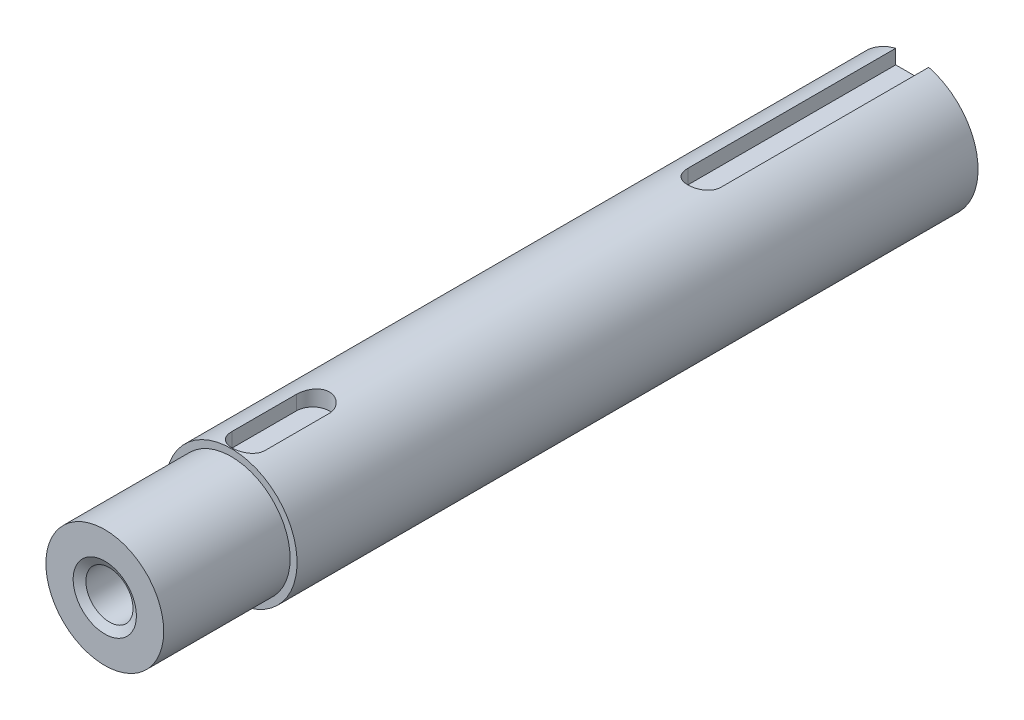
ISO-10303-21;
HEADER;
FILE_DESCRIPTION(('STEP AP214'),'2;1');
FILE_NAME('part.step','',(''),(''),'','','');
FILE_SCHEMA(('AUTOMOTIVE_DESIGN { 1 0 10303 214 1 1 1 1 }'));
ENDSEC;
DATA;
#1=APPLICATION_CONTEXT('core data for automotive mechanical design processes');
#2=APPLICATION_PROTOCOL_DEFINITION('international standard','automotive_design',2000,#1);
#3=PRODUCT_CONTEXT('',#1,'mechanical');
#4=PRODUCT('Part','Part','',(#3));
#5=PRODUCT_RELATED_PRODUCT_CATEGORY('part','',(#4));
#6=PRODUCT_DEFINITION_FORMATION('','',#4);
#7=PRODUCT_DEFINITION_CONTEXT('part definition',#1,'design');
#8=PRODUCT_DEFINITION('design','',#6,#7);
#9=PRODUCT_DEFINITION_SHAPE('','',#8);
#10=(LENGTH_UNIT() NAMED_UNIT(*) SI_UNIT(.MILLI.,.METRE.));
#11=(NAMED_UNIT(*) PLANE_ANGLE_UNIT() SI_UNIT($,.RADIAN.));
#12=(NAMED_UNIT(*) SI_UNIT($,.STERADIAN.) SOLID_ANGLE_UNIT());
#13=UNCERTAINTY_MEASURE_WITH_UNIT(LENGTH_MEASURE(1.E-05),#10,'distance_accuracy_value','');
#14=(GEOMETRIC_REPRESENTATION_CONTEXT(3) GLOBAL_UNCERTAINTY_ASSIGNED_CONTEXT((#13)) GLOBAL_UNIT_ASSIGNED_CONTEXT((#10,
#11,#12)) REPRESENTATION_CONTEXT('',''));
#15=CARTESIAN_POINT('',(0.,0.,0.));
#16=DIRECTION('',(0.,0.,1.));
#17=DIRECTION('',(1.,0.,0.));
#18=AXIS2_PLACEMENT_3D('',#15,#16,#17);
#19=CARTESIAN_POINT('',(-823.489345222977,-340.25157,-57.1466353350161));
#20=DIRECTION('',(0.,0.,1.));
#21=DIRECTION('',(1.,0.,0.));
#22=AXIS2_PLACEMENT_3D('',#19,#20,#21);
#23=CONICAL_SURFACE('',#22,3.39999999982443,1.02974425858158);
#24=CARTESIAN_POINT('',(-823.489345223322,-340.25157,-59.1895614397515));
#25=VERTEX_POINT('',#24);
#26=VERTEX_LOOP('',#25);
#27=FACE_BOUND('',#26,.T.);
#28=CARTESIAN_POINT('',(-823.489345222977,-340.25157,-57.146635334911));
#29=DIRECTION('',(0.,0.,1.));
#30=DIRECTION('',(1.,0.,0.));
#31=AXIS2_PLACEMENT_3D('',#28,#29,#30);
#32=CIRCLE('',#31,3.4);
#33=CARTESIAN_POINT('',(-820.089345222977,-340.25157,-57.146635334911));
#34=VERTEX_POINT('',#33);
#35=EDGE_CURVE('E191',#34,#34,#32,.T.);
#36=ORIENTED_EDGE('',*,*,#35,.T.);
#37=EDGE_LOOP('',(#36));
#38=FACE_BOUND('',#37,.T.);
#39=ADVANCED_FACE('F17',(#27,#38),#23,.F.);
#40=CARTESIAN_POINT('',(-823.489345222977,-340.25157,-33.646635334911));
#41=DIRECTION('',(0.,0.,1.));
#42=DIRECTION('',(1.,0.,0.));
#43=AXIS2_PLACEMENT_3D('',#40,#41,#42);
#44=CYLINDRICAL_SURFACE('',#43,3.4);
#45=ORIENTED_EDGE('',*,*,#35,.F.);
#46=EDGE_LOOP('',(#45));
#47=FACE_BOUND('',#46,.T.);
#48=CARTESIAN_POINT('',(-823.489345222977,-340.25157,-34.0678050228576));
#49=DIRECTION('',(0.,0.,1.));
#50=DIRECTION('',(1.,0.,0.));
#51=AXIS2_PLACEMENT_3D('',#48,#49,#50);
#52=CIRCLE('',#51,3.40000000005181);
#53=CARTESIAN_POINT('',(-820.089345222925,-340.25157,-34.0678050228576));
#54=VERTEX_POINT('',#53);
#55=EDGE_CURVE('E187',#54,#54,#52,.T.);
#56=ORIENTED_EDGE('',*,*,#55,.T.);
#57=EDGE_LOOP('',(#56));
#58=FACE_BOUND('',#57,.T.);
#59=ADVANCED_FACE('F262',(#47,#58),#44,.F.);
#60=CARTESIAN_POINT('',(-823.489345222977,-340.25157,-126.421635334793));
#61=DIRECTION('',(0.,0.,-1.));
#62=DIRECTION('',(-1.,0.,0.));
#63=AXIS2_PLACEMENT_3D('',#60,#61,#62);
#64=CONICAL_SURFACE('',#63,3.39999999983287,1.02974425859605);
#65=CARTESIAN_POINT('',(-823.489345223379,-340.25157,-124.378709230143));
#66=VERTEX_POINT('',#65);
#67=VERTEX_LOOP('',#66);
#68=FACE_BOUND('',#67,.T.);
#69=CARTESIAN_POINT('',(-823.489345222977,-340.25157,-126.421635334911));
#70=DIRECTION('',(0.,0.,-1.));
#71=DIRECTION('',(-1.,0.,0.));
#72=AXIS2_PLACEMENT_3D('',#69,#70,#71);
#73=CIRCLE('',#72,3.4);
#74=CARTESIAN_POINT('',(-826.889345222977,-340.25157,-126.421635334911));
#75=VERTEX_POINT('',#74);
#76=EDGE_CURVE('E183',#75,#75,#73,.T.);
#77=ORIENTED_EDGE('',*,*,#76,.T.);
#78=EDGE_LOOP('',(#77));
#79=FACE_BOUND('',#78,.T.);
#80=ADVANCED_FACE('F259',(#68,#79),#64,.F.);
#81=CARTESIAN_POINT('',(-823.489345222977,-340.25157,-33.3966353350093));
#82=DIRECTION('',(0.,0.,1.));
#83=DIRECTION('',(1.,0.,0.));
#84=AXIS2_PLACEMENT_3D('',#81,#82,#83);
#85=CONICAL_SURFACE('',#84,4.5624999999021,1.04719755120111);
#86=CARTESIAN_POINT('',(-823.489345222977,-340.25157,-33.3966353349412));
#87=DIRECTION('',(0.,0.,1.));
#88=DIRECTION('',(1.,0.,0.));
#89=AXIS2_PLACEMENT_3D('',#86,#87,#88);
#90=CIRCLE('',#89,4.56250000002001);
#91=CARTESIAN_POINT('',(-818.926845222957,-340.25157,-33.3966353349412));
#92=VERTEX_POINT('',#91);
#93=EDGE_CURVE('E20',#92,#92,#90,.T.);
#94=ORIENTED_EDGE('',*,*,#93,.T.);
#95=EDGE_LOOP('',(#94));
#96=FACE_BOUND('',#95,.T.);
#97=ORIENTED_EDGE('',*,*,#55,.F.);
#98=EDGE_LOOP('',(#97));
#99=FACE_BOUND('',#98,.T.);
#100=ADVANCED_FACE('F255',(#96,#99),#85,.F.);
#101=CARTESIAN_POINT('',(-748.489347611488,-340.251572168843,-33.396635334911));
#102=DIRECTION('',(0.,0.,-1.));
#103=DIRECTION('',(-1.,0.,0.));
#104=AXIS2_PLACEMENT_3D('',#101,#102,#103);
#105=PLANE('',#104);
#106=CARTESIAN_POINT('',(-823.489347611488,-340.251572168843,-33.396635334911));
#107=DIRECTION('',(0.,0.,1.));
#108=DIRECTION('',(1.,0.,0.));
#109=AXIS2_PLACEMENT_3D('',#106,#107,#108);
#110=CIRCLE('',#109,8.5);
#111=CARTESIAN_POINT('',(-814.989347611488,-340.251572168843,-33.396635334911));
#112=VERTEX_POINT('',#111);
#113=EDGE_CURVE('E458',#112,#112,#110,.F.);
#114=ORIENTED_EDGE('',*,*,#113,.F.);
#115=EDGE_LOOP('',(#114));
#116=FACE_BOUND('',#115,.T.);
#117=ORIENTED_EDGE('',*,*,#93,.F.);
#118=EDGE_LOOP('',(#117));
#119=FACE_BOUND('',#118,.T.);
#120=ADVANCED_FACE('F252',(#116,#119),#105,.F.);
#121=CARTESIAN_POINT('',(-825.870597611488,-333.132822168843,-79.1602681489316));
#122=DIRECTION('',(0.,-1.,0.));
#123=DIRECTION('',(0.,0.,-1.));
#124=AXIS2_PLACEMENT_3D('',#121,#122,#123);
#125=PLANE('',#124);
#126=CARTESIAN_POINT('',(-823.489347611488,-333.132822168843,-63.4227681489316));
#127=DIRECTION('',(0.,1.,0.));
#128=DIRECTION('',(0.,0.,1.));
#129=AXIS2_PLACEMENT_3D('',#126,#127,#128);
#130=CIRCLE('',#129,2.38125);
#131=CARTESIAN_POINT('',(-821.108097611488,-333.132822168843,-63.4227681489316));
#132=VERTEX_POINT('',#131);
#133=CARTESIAN_POINT('',(-825.870597611488,-333.132822168843,-63.4227681489316));
#134=VERTEX_POINT('',#133);
#135=EDGE_CURVE('E182',#132,#134,#130,.T.);
#136=ORIENTED_EDGE('',*,*,#135,.T.);
#137=DIRECTION('',(0.,0.,1.));
#138=VECTOR('',#137,1.);
#139=CARTESIAN_POINT('',(-825.870597611488,-333.132822168843,-79.1602681489316));
#140=LINE('',#139,#138);
#141=CARTESIAN_POINT('',(-825.870597611488,-333.132822168843,-54.1602681489316));
#142=VERTEX_POINT('',#141);
#143=EDGE_CURVE('E160',#134,#142,#140,.T.);
#144=ORIENTED_EDGE('',*,*,#143,.T.);
#145=CARTESIAN_POINT('',(-823.489347611488,-333.132822168843,-54.1602681489316));
#146=DIRECTION('',(0.,1.,0.));
#147=DIRECTION('',(0.,0.,1.));
#148=AXIS2_PLACEMENT_3D('',#145,#146,#147);
#149=CIRCLE('',#148,2.38125);
#150=CARTESIAN_POINT('',(-821.108097611488,-333.132822168843,-54.1602681489316));
#151=VERTEX_POINT('',#150);
#152=EDGE_CURVE('E168',#142,#151,#149,.T.);
#153=ORIENTED_EDGE('',*,*,#152,.T.);
#154=DIRECTION('',(0.,0.,-1.));
#155=VECTOR('',#154,1.);
#156=CARTESIAN_POINT('',(-821.108097611488,-333.132822168843,-79.1602681489316));
#157=LINE('',#156,#155);
#158=EDGE_CURVE('E80',#151,#132,#157,.T.);
#159=ORIENTED_EDGE('',*,*,#158,.T.);
#160=EDGE_LOOP('',(#136,#144,#153,#159));
#161=FACE_BOUND('',#160,.T.);
#162=ADVANCED_FACE('F248',(#161),#125,.F.);
#163=CARTESIAN_POINT('',(-823.489345222977,-340.25157,-149.921635334911));
#164=DIRECTION('',(0.,0.,-1.));
#165=DIRECTION('',(-1.,0.,0.));
#166=AXIS2_PLACEMENT_3D('',#163,#164,#165);
#167=CYLINDRICAL_SURFACE('',#166,3.4);
#168=ORIENTED_EDGE('',*,*,#76,.F.);
#169=EDGE_LOOP('',(#168));
#170=FACE_BOUND('',#169,.T.);
#171=CARTESIAN_POINT('',(-823.489345222977,-340.25157,-149.250465646958));
#172=DIRECTION('',(0.,0.,-1.));
#173=DIRECTION('',(-1.,0.,0.));
#174=AXIS2_PLACEMENT_3D('',#171,#172,#173);
#175=CIRCLE('',#174,3.40000000006024);
#176=CARTESIAN_POINT('',(-826.889345223037,-340.25157,-149.250465646958));
#177=VERTEX_POINT('',#176);
#178=EDGE_CURVE('E159',#177,#177,#175,.T.);
#179=ORIENTED_EDGE('',*,*,#178,.T.);
#180=EDGE_LOOP('',(#179));
#181=FACE_BOUND('',#180,.T.);
#182=ADVANCED_FACE('F244',(#170,#181),#167,.F.);
#183=CARTESIAN_POINT('',(-823.489347611488,-340.251572168843,-24.1216353349109));
#184=DIRECTION('',(0.,0.,1.));
#185=DIRECTION('',(1.,0.,0.));
#186=AXIS2_PLACEMENT_3D('',#183,#184,#185);
#187=CYLINDRICAL_SURFACE('',#186,8.5);
#188=ORIENTED_EDGE('',*,*,#113,.T.);
#189=EDGE_LOOP('',(#188));
#190=FACE_BOUND('',#189,.T.);
#191=CARTESIAN_POINT('',(-823.489347611488,-340.251572168843,-51.6466353349109));
#192=DIRECTION('',(0.,0.,1.));
#193=DIRECTION('',(1.,0.,0.));
#194=AXIS2_PLACEMENT_3D('',#191,#192,#193);
#195=CIRCLE('',#194,8.5);
#196=CARTESIAN_POINT('',(-814.989347611488,-340.251572168843,-51.6466353349109));
#197=VERTEX_POINT('',#196);
#198=EDGE_CURVE('E146',#197,#197,#195,.T.);
#199=ORIENTED_EDGE('',*,*,#198,.T.);
#200=EDGE_LOOP('',(#199));
#201=FACE_BOUND('',#200,.T.);
#202=ADVANCED_FACE('F239',(#190,#201),#187,.T.);
#203=CARTESIAN_POINT('',(-823.489347611488,-333.132822168842,-119.921635334911));
#204=DIRECTION('',(0.,1.,0.));
#205=DIRECTION('',(0.,0.,1.));
#206=AXIS2_PLACEMENT_3D('',#203,#204,#205);
#207=CYLINDRICAL_SURFACE('',#206,2.38125);
#208=DIRECTION('',(0.,1.,0.));
#209=VECTOR('',#208,1.);
#210=CARTESIAN_POINT('',(-821.108097611488,-333.132822168843,-119.921635334911));
#211=LINE('',#210,#209);
#212=CARTESIAN_POINT('',(-821.108097611488,-333.132822168842,-119.921635334911));
#213=VERTEX_POINT('',#212);
#214=CARTESIAN_POINT('',(-821.108097611488,-331.054852729961,-119.921635334912));
#215=VERTEX_POINT('',#214);
#216=EDGE_CURVE('E149',#213,#215,#211,.T.);
#217=ORIENTED_EDGE('',*,*,#216,.F.);
#218=CARTESIAN_POINT('',(-823.489347611488,-333.132822168842,-119.921635334911));
#219=DIRECTION('',(0.,1.,0.));
#220=DIRECTION('',(0.,0.,1.));
#221=AXIS2_PLACEMENT_3D('',#218,#219,#220);
#222=CIRCLE('',#221,2.38125);
#223=CARTESIAN_POINT('',(-825.870597611488,-333.132822168842,-119.921635334911));
#224=VERTEX_POINT('',#223);
#225=EDGE_CURVE('E100',#224,#213,#222,.T.);
#226=ORIENTED_EDGE('',*,*,#225,.F.);
#227=DIRECTION('',(0.,1.,0.));
#228=VECTOR('',#227,1.);
#229=CARTESIAN_POINT('',(-825.870597611488,-330.751572168843,-119.921635334911));
#230=LINE('',#229,#228);
#231=CARTESIAN_POINT('',(-825.870597611488,-331.054852729961,-119.921635334911));
#232=VERTEX_POINT('',#231);
#233=EDGE_CURVE('E96',#232,#224,#230,.F.);
#234=ORIENTED_EDGE('',*,*,#233,.F.);
#235=CARTESIAN_POINT('',(-821.108097611488,-331.054852729961,-119.921635334913));
#236=CARTESIAN_POINT('',(-821.108089976221,-331.05486010957,-119.855787558025));
#237=CARTESIAN_POINT('',(-821.110828790116,-331.054145698006,-119.789944314432));
#238=CARTESIAN_POINT('',(-821.121740012587,-331.051328025973,-119.658750309431));
#239=CARTESIAN_POINT('',(-821.129911503244,-331.049225000129,-119.593399466711));
#240=CARTESIAN_POINT('',(-821.151607288473,-331.043690289544,-119.463779708277));
#241=CARTESIAN_POINT('',(-821.165120940553,-331.040261246748,-119.399508904729));
#242=CARTESIAN_POINT('',(-821.197375461666,-331.032182929257,-119.272388768386));
#243=CARTESIAN_POINT('',(-821.216116403339,-331.027533637606,-119.209539455358));
#244=CARTESIAN_POINT('',(-821.27997421957,-331.011950113258,-119.023792057215));
#245=CARTESIAN_POINT('',(-821.332748151469,-330.999374241706,-118.903563884514));
#246=CARTESIAN_POINT('',(-821.457082149676,-330.971274024145,-118.673693339908));
#247=CARTESIAN_POINT('',(-821.528647298336,-330.955748880778,-118.564053842848));
#248=CARTESIAN_POINT('',(-821.690226656674,-330.923117054144,-118.356006867709));
#249=CARTESIAN_POINT('',(-821.780578068754,-330.905985144882,-118.257864734153));
#250=CARTESIAN_POINT('',(-821.976441550724,-330.872287863405,-118.077954929861));
#251=CARTESIAN_POINT('',(-822.081956040718,-330.855722582149,-117.996189877985));
#252=CARTESIAN_POINT('',(-822.306981146889,-330.824745132794,-117.850261697089));
#253=CARTESIAN_POINT('',(-822.426667285529,-330.810366416133,-117.78636148503));
#254=CARTESIAN_POINT('',(-822.67549678418,-330.785672620992,-117.679691223162));
#255=CARTESIAN_POINT('',(-822.804638270314,-330.775356739903,-117.636916999511));
#256=CARTESIAN_POINT('',(-823.065929312303,-330.760129318496,-117.574564921255));
#257=CARTESIAN_POINT('',(-823.19796419907,-330.755112087277,-117.554532800581));
#258=CARTESIAN_POINT('',(-823.463612402534,-330.750678861506,-117.536807521339));
#259=CARTESIAN_POINT('',(-823.597225517499,-330.751262158656,-117.53911153793));
#260=CARTESIAN_POINT('',(-823.859080300752,-330.757885858691,-117.565667500634));
#261=CARTESIAN_POINT('',(-823.987375300771,-330.763804212335,-117.589428597883));
#262=CARTESIAN_POINT('',(-824.238094543479,-330.780290754499,-117.657434856075));
#263=CARTESIAN_POINT('',(-824.360518525372,-330.790859149366,-117.701680926049));
#264=CARTESIAN_POINT('',(-824.59731498692,-330.815644930064,-117.809798045316));
#265=CARTESIAN_POINT('',(-824.71160418676,-330.829894603904,-117.873843785747));
#266=CARTESIAN_POINT('',(-824.927981970364,-330.860497158781,-118.019608446692));
#267=CARTESIAN_POINT('',(-825.030068700878,-330.876850358511,-118.101330046444));
#268=CARTESIAN_POINT('',(-825.222063297868,-330.910401822156,-118.282745582209));
#269=CARTESIAN_POINT('',(-825.311566142203,-330.927610977356,-118.382866552452));
#270=CARTESIAN_POINT('',(-825.472623042038,-330.960533609431,-118.596905914227));
#271=CARTESIAN_POINT('',(-825.544172182964,-330.976246676044,-118.710828071013));
#272=CARTESIAN_POINT('',(-825.667557370399,-331.004440463708,-118.950052342665));
#273=CARTESIAN_POINT('',(-825.71928428658,-331.016903173377,-119.07541288113));
#274=CARTESIAN_POINT('',(-825.800736271142,-331.036949467608,-119.333364634979));
#275=CARTESIAN_POINT('',(-825.83049423556,-331.044540344956,-119.465944718926));
#276=CARTESIAN_POINT('',(-825.856049427242,-331.051096067702,-119.653334207915));
#277=CARTESIAN_POINT('',(-825.861505920603,-331.05250262981,-119.706883827573));
#278=CARTESIAN_POINT('',(-825.86877592608,-331.054380550735,-119.814158915062));
#279=CARTESIAN_POINT('',(-825.870595327722,-331.054853421459,-119.867883957268));
#280=CARTESIAN_POINT('',(-825.870597611488,-331.054852729961,-119.921635334911));
#281=B_SPLINE_CURVE_WITH_KNOTS('',3,(#235,#236,#237,#238,#239,#240,#241,#242,#243,#244,#245,
#246,#247,#248,#249,#250,#251,#252,#253,#254,#255,#256,#257,#258,#259,#260,#261,#262,#263,#264,
#265,#266,#267,#268,#269,#270,#271,#272,#273,#274,#275,#276,#277,#278,#279,#280),.UNSPECIFIED.,
.F.,.F.,(4,2,2,2,2,2,2,2,2,2,2,2,2,2,2,2,2,2,2,2,2,2,4),(0.,0.197474704140472,0.394916050928373,
0.591966027368922,0.789018742246104,1.18273133142484,1.57655051563343,1.9781664973454,
2.37984665031194,2.78715969626205,3.19439223754331,3.59333885448179,3.99223501748329,
4.38223101538147,4.77224432120971,5.16580193710746,5.55941924879617,5.96370362092649,
6.36809853978222,6.77468890082811,7.18066919669186,7.3420997531972,7.50326869350217),.UNSPECIFIED.);
#282=EDGE_CURVE('E142',#215,#232,#281,.T.);
#283=ORIENTED_EDGE('',*,*,#282,.F.);
#284=EDGE_LOOP('',(#217,#226,#234,#283));
#285=FACE_BOUND('',#284,.T.);
#286=ADVANCED_FACE('F234',(#285),#207,.F.);
#287=CARTESIAN_POINT('',(-823.489347611488,-333.132822168842,-63.4227681489316));
#288=DIRECTION('',(0.,1.,0.));
#289=DIRECTION('',(0.,0.,1.));
#290=AXIS2_PLACEMENT_3D('',#287,#288,#289);
#291=CYLINDRICAL_SURFACE('',#290,2.38125);
#292=ORIENTED_EDGE('',*,*,#135,.F.);
#293=DIRECTION('',(0.,1.,0.));
#294=VECTOR('',#293,1.);
#295=CARTESIAN_POINT('',(-821.108097611488,-333.132822168843,-63.4227681489316));
#296=LINE('',#295,#294);
#297=CARTESIAN_POINT('',(-821.108097611488,-331.054852729961,-63.4227681489316));
#298=VERTEX_POINT('',#297);
#299=EDGE_CURVE('E169',#132,#298,#296,.T.);
#300=ORIENTED_EDGE('',*,*,#299,.T.);
#301=CARTESIAN_POINT('',(-825.870597611488,-331.054852729961,-63.4227681489316));
#302=CARTESIAN_POINT('',(-825.870605246755,-331.05486010957,-63.4886159258194));
#303=CARTESIAN_POINT('',(-825.86786643286,-331.054145698006,-63.5544591694117));
#304=CARTESIAN_POINT('',(-825.85695521039,-331.051328025973,-63.6856531744129));
#305=CARTESIAN_POINT('',(-825.848783719733,-331.049225000129,-63.7510040171331));
#306=CARTESIAN_POINT('',(-825.827087934503,-331.043690289544,-63.8806237755675));
#307=CARTESIAN_POINT('',(-825.813574282422,-331.040261246748,-63.9448945791152));
#308=CARTESIAN_POINT('',(-825.78131976131,-331.032182929257,-64.0720147154577));
#309=CARTESIAN_POINT('',(-825.762578819636,-331.027533637606,-64.1348640284856));
#310=CARTESIAN_POINT('',(-825.698721003406,-331.011950113258,-64.3206114266293));
#311=CARTESIAN_POINT('',(-825.645947071507,-330.999374241706,-64.4408395993297));
#312=CARTESIAN_POINT('',(-825.521613073299,-330.971274024145,-64.6707101439363));
#313=CARTESIAN_POINT('',(-825.450047924639,-330.955748880778,-64.7803496409955));
#314=CARTESIAN_POINT('',(-825.288468566301,-330.923117054143,-64.9883966161352));
#315=CARTESIAN_POINT('',(-825.198117154221,-330.905985144882,-65.0865387496911));
#316=CARTESIAN_POINT('',(-825.00225367225,-330.872287863404,-65.2664485539829));
#317=CARTESIAN_POINT('',(-824.896739182257,-330.855722582149,-65.3482136058586));
#318=CARTESIAN_POINT('',(-824.671714076086,-330.824745132794,-65.4941417867546));
#319=CARTESIAN_POINT('',(-824.552027937446,-330.810366416133,-65.558041998813));
#320=CARTESIAN_POINT('',(-824.303198438794,-330.785672620992,-65.6647122606809));
#321=CARTESIAN_POINT('',(-824.17405695266,-330.775356739903,-65.7074864843317));
#322=CARTESIAN_POINT('',(-823.912765910671,-330.760129318496,-65.7698385625876));
#323=CARTESIAN_POINT('',(-823.780731023904,-330.755112087277,-65.7898706832617));
#324=CARTESIAN_POINT('',(-823.51508282044,-330.750678861506,-65.8075959625038));
#325=CARTESIAN_POINT('',(-823.381469705475,-330.751262158656,-65.805291945913));
#326=CARTESIAN_POINT('',(-823.119614922223,-330.757885858691,-65.7787359832082));
#327=CARTESIAN_POINT('',(-822.991319922204,-330.763804212335,-65.7549748859591));
#328=CARTESIAN_POINT('',(-822.740600679496,-330.780290754499,-65.6869686277672));
#329=CARTESIAN_POINT('',(-822.618176697602,-330.790859149366,-65.6427225577932));
#330=CARTESIAN_POINT('',(-822.381380236055,-330.815644930064,-65.5346054385256));
#331=CARTESIAN_POINT('',(-822.267091036215,-330.829894603904,-65.4705596980945));
#332=CARTESIAN_POINT('',(-822.050713252611,-330.860497158781,-65.3247950371498));
#333=CARTESIAN_POINT('',(-821.948626522097,-330.876850358511,-65.2430734373981));
#334=CARTESIAN_POINT('',(-821.756631925107,-330.910401822157,-65.0616579016326));
#335=CARTESIAN_POINT('',(-821.667129080772,-330.927610977356,-64.9615369313894));
#336=CARTESIAN_POINT('',(-821.506072180938,-330.960533609431,-64.7474975696144));
#337=CARTESIAN_POINT('',(-821.434523040012,-330.976246676044,-64.6335754128285));
#338=CARTESIAN_POINT('',(-821.311137852576,-331.004440463709,-64.3943511411763));
#339=CARTESIAN_POINT('',(-821.259410936395,-331.016903173377,-64.2689906027108));
#340=CARTESIAN_POINT('',(-821.177958951834,-331.036949467608,-64.0110388488616));
#341=CARTESIAN_POINT('',(-821.148200987415,-331.044540344956,-63.8784587649153));
#342=CARTESIAN_POINT('',(-821.122645795734,-331.051096067702,-63.6910692759267));
#343=CARTESIAN_POINT('',(-821.117189302373,-331.05250262981,-63.6375196562684));
#344=CARTESIAN_POINT('',(-821.109919296896,-331.054380550735,-63.5302445687804));
#345=CARTESIAN_POINT('',(-821.108099895254,-331.054853421459,-63.476519526574));
#346=CARTESIAN_POINT('',(-821.108097611488,-331.054852729961,-63.4227681489316));
#347=B_SPLINE_CURVE_WITH_KNOTS('',3,(#301,#302,#303,#304,#305,#306,#307,#308,#309,#310,#311,
#312,#313,#314,#315,#316,#317,#318,#319,#320,#321,#322,#323,#324,#325,#326,#327,#328,#329,#330,
#331,#332,#333,#334,#335,#336,#337,#338,#339,#340,#341,#342,#343,#344,#345,#346),.UNSPECIFIED.,
.F.,.F.,(4,2,2,2,2,2,2,2,2,2,2,2,2,2,2,2,2,2,2,2,2,2,4),(0.,0.19747470414049,0.39491605092838,
0.591966027368938,0.789018742246165,1.18273133142486,1.57655051563353,1.97816649734545,
2.37984665031217,2.78715969626238,3.19439223754353,3.59333885448208,3.99223501748336,
4.38223101538159,4.77224432120981,5.16580193710746,5.55941924879623,5.96370362092652,
6.3680985397823,6.7746889008282,7.18066919669196,7.34209975319649,7.50326869350066),.UNSPECIFIED.);
#348=CARTESIAN_POINT('',(-825.870597611488,-331.054852729961,-63.4227681489316));
#349=VERTEX_POINT('',#348);
#350=EDGE_CURVE('E138',#349,#298,#347,.T.);
#351=ORIENTED_EDGE('',*,*,#350,.F.);
#352=DIRECTION('',(0.,1.,0.));
#353=VECTOR('',#352,1.);
#354=CARTESIAN_POINT('',(-825.870597611488,-330.751572168843,-63.4227681489316));
#355=LINE('',#354,#353);
#356=EDGE_CURVE('E161',#349,#134,#355,.F.);
#357=ORIENTED_EDGE('',*,*,#356,.T.);
#358=EDGE_LOOP('',(#292,#300,#351,#357));
#359=FACE_BOUND('',#358,.T.);
#360=ADVANCED_FACE('F238',(#359),#291,.F.);
#361=CARTESIAN_POINT('',(-821.108097611488,-333.132822168843,-79.1602681489316));
#362=DIRECTION('',(1.,0.,0.));
#363=DIRECTION('',(0.,0.,-1.));
#364=AXIS2_PLACEMENT_3D('',#361,#362,#363);
#365=PLANE('',#364);
#366=ORIENTED_EDGE('',*,*,#158,.F.);
#367=DIRECTION('',(0.,1.,0.));
#368=VECTOR('',#367,1.);
#369=CARTESIAN_POINT('',(-821.108097611488,-333.132822168842,-54.1602681489316));
#370=LINE('',#369,#368);
#371=CARTESIAN_POINT('',(-821.108097611488,-331.054852729961,-54.160268148903));
#372=VERTEX_POINT('',#371);
#373=EDGE_CURVE('E165',#151,#372,#370,.T.);
#374=ORIENTED_EDGE('',*,*,#373,.T.);
#375=DIRECTION('',(0.,0.,-1.));
#376=VECTOR('',#375,1.);
#377=CARTESIAN_POINT('',(-821.108097611488,-331.054852729961,-149.921635334911));
#378=LINE('',#377,#376);
#379=EDGE_CURVE('E135',#298,#372,#378,.F.);
#380=ORIENTED_EDGE('',*,*,#379,.F.);
#381=ORIENTED_EDGE('',*,*,#299,.F.);
#382=EDGE_LOOP('',(#366,#374,#380,#381));
#383=FACE_BOUND('',#382,.T.);
#384=ADVANCED_FACE('F328',(#383),#365,.F.);
#385=CARTESIAN_POINT('',(-823.489347611488,-333.132822168842,-54.1602681489316));
#386=DIRECTION('',(0.,1.,0.));
#387=DIRECTION('',(0.,0.,1.));
#388=AXIS2_PLACEMENT_3D('',#385,#386,#387);
#389=CYLINDRICAL_SURFACE('',#388,2.38125);
#390=CARTESIAN_POINT('',(-821.108097611488,-331.054852729961,-54.1602681488743));
#391=CARTESIAN_POINT('',(-821.108089976223,-331.05486010957,-54.0944203719863));
#392=CARTESIAN_POINT('',(-821.110828790119,-331.054145698005,-54.0285771283941));
#393=CARTESIAN_POINT('',(-821.121740012593,-331.051328025972,-53.8973831233929));
#394=CARTESIAN_POINT('',(-821.129911503252,-331.049225000127,-53.8320322806728));
#395=CARTESIAN_POINT('',(-821.151607288485,-331.043690289542,-53.7024125222387));
#396=CARTESIAN_POINT('',(-821.165120940566,-331.040261246745,-53.6381417186912));
#397=CARTESIAN_POINT('',(-821.197375461682,-331.032182929253,-53.5110215823494));
#398=CARTESIAN_POINT('',(-821.216116403357,-331.027533637601,-53.4481722693218));
#399=CARTESIAN_POINT('',(-821.279974219593,-331.011950113252,-53.2624248711794));
#400=CARTESIAN_POINT('',(-821.332748151494,-330.9993742417,-53.1421966984803));
#401=CARTESIAN_POINT('',(-821.457082149708,-330.971274024138,-52.9123261538764));
#402=CARTESIAN_POINT('',(-821.528647298371,-330.955748880771,-52.8026866568189));
#403=CARTESIAN_POINT('',(-821.690226656715,-330.923117054136,-52.5946396816829));
#404=CARTESIAN_POINT('',(-821.780578068797,-330.905985144874,-52.4964975481291));
#405=CARTESIAN_POINT('',(-821.976441550773,-330.872287863397,-52.3165877438419));
#406=CARTESIAN_POINT('',(-822.081956040769,-330.855722582142,-52.2348226919687));
#407=CARTESIAN_POINT('',(-822.306981146943,-330.824745132787,-52.0888945110783));
#408=CARTESIAN_POINT('',(-822.426667285585,-330.810366416127,-52.024994299023));
#409=CARTESIAN_POINT('',(-822.675496784239,-330.785672620987,-51.9183240371614));
#410=CARTESIAN_POINT('',(-822.804638270374,-330.775356739899,-51.8755498135139));
#411=CARTESIAN_POINT('',(-823.065929312365,-330.760129318493,-51.8131977352648));
#412=CARTESIAN_POINT('',(-823.197964199132,-330.755112087275,-51.7931656145941));
#413=CARTESIAN_POINT('',(-823.463612402596,-330.750678861506,-51.7754403353587));
#414=CARTESIAN_POINT('',(-823.597225517561,-330.751262158657,-51.7777443519529));
#415=CARTESIAN_POINT('',(-823.859080300812,-330.757885858693,-51.8043003146643));
#416=CARTESIAN_POINT('',(-823.987375300831,-330.763804212338,-51.8280614119165));
#417=CARTESIAN_POINT('',(-824.238094543537,-330.780290754503,-51.8960676701146));
#418=CARTESIAN_POINT('',(-824.360518525429,-330.790859149371,-51.9403137400916));
#419=CARTESIAN_POINT('',(-824.597314986974,-330.815644930071,-52.0484308593651));
#420=CARTESIAN_POINT('',(-824.711604186812,-330.829894603911,-52.1124765997991));
#421=CARTESIAN_POINT('',(-824.927981970412,-330.860497158789,-52.2582412607494));
#422=CARTESIAN_POINT('',(-825.030068700925,-330.876850358518,-52.3399628605038));
#423=CARTESIAN_POINT('',(-825.22206329791,-330.910401822164,-52.5213783962744));
#424=CARTESIAN_POINT('',(-825.311566142243,-330.927610977363,-52.62149936652));
#425=CARTESIAN_POINT('',(-825.472623042072,-330.960533609438,-52.8355387282996));
#426=CARTESIAN_POINT('',(-825.544172182995,-330.976246676051,-52.9494608850875));
#427=CARTESIAN_POINT('',(-825.667557370425,-331.004440463714,-53.1886851567431));
#428=CARTESIAN_POINT('',(-825.719284286603,-331.016903173382,-53.3140456952098));
#429=CARTESIAN_POINT('',(-825.800736271157,-331.036949467612,-53.571997449061));
#430=CARTESIAN_POINT('',(-825.830494235572,-331.044540344959,-53.704577533008));
#431=CARTESIAN_POINT('',(-825.856049427248,-331.051096067703,-53.891967021987));
#432=CARTESIAN_POINT('',(-825.861505920607,-331.05250262981,-53.9455166416353));
#433=CARTESIAN_POINT('',(-825.868775926081,-331.054380550735,-54.0527917291031));
#434=CARTESIAN_POINT('',(-825.870595327722,-331.054853421459,-54.1065167712993));
#435=CARTESIAN_POINT('',(-825.870597611488,-331.054852729961,-54.1602681489316));
#436=B_SPLINE_CURVE_WITH_KNOTS('',3,(#390,#391,#392,#393,#394,#395,#396,#397,#398,#399,#400,
#401,#402,#403,#404,#405,#406,#407,#408,#409,#410,#411,#412,#413,#414,#415,#416,#417,#418,#419,
#420,#421,#422,#423,#424,#425,#426,#427,#428,#429,#430,#431,#432,#433,#434,#435),.UNSPECIFIED.,
.F.,.F.,(4,2,2,2,2,2,2,2,2,2,2,2,2,2,2,2,2,2,2,2,2,2,4),(0.,0.19747470414084,0.394916050929113,
0.591966027369983,0.789018742247509,1.18273133142687,1.57655051563614,1.97816649734877,
2.37984665031641,2.78715969626632,3.19439223754749,3.59333885448519,3.99223501748566,
4.38223101538353,4.7722443212116,5.16580193710999,5.55941924879943,5.96370362093029,
6.36809853978683,6.77468890083239,7.18066919669562,7.34209975316966,7.50326869344337),.UNSPECIFIED.);
#437=CARTESIAN_POINT('',(-825.870597611488,-331.054852729961,-54.1602681489316));
#438=VERTEX_POINT('',#437);
#439=EDGE_CURVE('E134',#372,#438,#436,.T.);
#440=ORIENTED_EDGE('',*,*,#439,.F.);
#441=ORIENTED_EDGE('',*,*,#373,.F.);
#442=ORIENTED_EDGE('',*,*,#152,.F.);
#443=DIRECTION('',(0.,1.,0.));
#444=VECTOR('',#443,1.);
#445=CARTESIAN_POINT('',(-825.870597611488,-330.751572168843,-54.1602681489316));
#446=LINE('',#445,#444);
#447=EDGE_CURVE('E156',#142,#438,#446,.T.);
#448=ORIENTED_EDGE('',*,*,#447,.T.);
#449=EDGE_LOOP('',(#440,#441,#442,#448));
#450=FACE_BOUND('',#449,.T.);
#451=ADVANCED_FACE('F213',(#450),#389,.F.);
#452=CARTESIAN_POINT('',(-825.870597611488,-330.751572168843,-79.1602681489316));
#453=DIRECTION('',(-1.,0.,0.));
#454=DIRECTION('',(0.,0.,1.));
#455=AXIS2_PLACEMENT_3D('',#452,#453,#454);
#456=PLANE('',#455);
#457=ORIENTED_EDGE('',*,*,#447,.F.);
#458=ORIENTED_EDGE('',*,*,#143,.F.);
#459=ORIENTED_EDGE('',*,*,#356,.F.);
#460=DIRECTION('',(0.,0.,-1.));
#461=VECTOR('',#460,1.);
#462=CARTESIAN_POINT('',(-825.870597611488,-331.054852729961,-149.921635334911));
#463=LINE('',#462,#461);
#464=EDGE_CURVE('E123',#438,#349,#463,.T.);
#465=ORIENTED_EDGE('',*,*,#464,.F.);
#466=EDGE_LOOP('',(#457,#458,#459,#465));
#467=FACE_BOUND('',#466,.T.);
#468=ADVANCED_FACE('F343',(#467),#456,.F.);
#469=CARTESIAN_POINT('',(-823.489345222977,-340.25157,-149.921635334863));
#470=DIRECTION('',(0.,0.,-1.));
#471=DIRECTION('',(-1.,0.,0.));
#472=AXIS2_PLACEMENT_3D('',#469,#470,#471);
#473=CONICAL_SURFACE('',#472,4.56250000002423,1.04719755120111);
#474=CARTESIAN_POINT('',(-823.489345222977,-340.25157,-149.92163533486));
#475=DIRECTION('',(0.,0.,-1.));
#476=DIRECTION('',(-1.,0.,0.));
#477=AXIS2_PLACEMENT_3D('',#474,#475,#476);
#478=CIRCLE('',#477,4.56250000002001);
#479=CARTESIAN_POINT('',(-828.051845222997,-340.25157,-149.92163533486));
#480=VERTEX_POINT('',#479);
#481=EDGE_CURVE('E116',#480,#480,#478,.F.);
#482=ORIENTED_EDGE('',*,*,#481,.F.);
#483=EDGE_LOOP('',(#482));
#484=FACE_BOUND('',#483,.T.);
#485=ORIENTED_EDGE('',*,*,#178,.F.);
#486=EDGE_LOOP('',(#485));
#487=FACE_BOUND('',#486,.T.);
#488=ADVANCED_FACE('F351',(#484,#487),#473,.F.);
#489=CARTESIAN_POINT('',(-825.870597611488,-330.751572168843,-149.921635334911));
#490=DIRECTION('',(1.,0.,0.));
#491=DIRECTION('',(0.,0.,-1.));
#492=AXIS2_PLACEMENT_3D('',#489,#490,#491);
#493=PLANE('',#492);
#494=DIRECTION('',(0.,0.,1.));
#495=VECTOR('',#494,1.);
#496=CARTESIAN_POINT('',(-825.870597611488,-333.132822168843,-149.921635334911));
#497=LINE('',#496,#495);
#498=CARTESIAN_POINT('',(-825.870597611488,-333.132822168843,-149.921635334911));
#499=VERTEX_POINT('',#498);
#500=EDGE_CURVE('E90',#499,#224,#497,.T.);
#501=ORIENTED_EDGE('',*,*,#500,.F.);
#502=DIRECTION('',(0.,1.,0.));
#503=VECTOR('',#502,1.);
#504=CARTESIAN_POINT('',(-825.870597611488,-340.251572168842,-149.921635334911));
#505=LINE('',#504,#503);
#506=CARTESIAN_POINT('',(-825.870597611488,-331.054852729961,-149.921635334911));
#507=VERTEX_POINT('',#506);
#508=EDGE_CURVE('E95',#507,#499,#505,.F.);
#509=ORIENTED_EDGE('',*,*,#508,.F.);
#510=DIRECTION('',(0.,0.,-1.));
#511=VECTOR('',#510,1.);
#512=CARTESIAN_POINT('',(-825.870597611488,-331.054852729961,-149.921635334911));
#513=LINE('',#512,#511);
#514=EDGE_CURVE('E139',#232,#507,#513,.T.);
#515=ORIENTED_EDGE('',*,*,#514,.F.);
#516=ORIENTED_EDGE('',*,*,#233,.T.);
#517=EDGE_LOOP('',(#501,#509,#515,#516));
#518=FACE_BOUND('',#517,.T.);
#519=ADVANCED_FACE('F92',(#518),#493,.T.);
#520=CARTESIAN_POINT('',(-825.870597611488,-333.132822168843,-149.921635334911));
#521=DIRECTION('',(0.,1.,0.));
#522=DIRECTION('',(0.,0.,1.));
#523=AXIS2_PLACEMENT_3D('',#520,#521,#522);
#524=PLANE('',#523);
#525=ORIENTED_EDGE('',*,*,#225,.T.);
#526=DIRECTION('',(0.,0.,1.));
#527=VECTOR('',#526,1.);
#528=CARTESIAN_POINT('',(-821.108097611488,-333.132822168843,-149.921635334911));
#529=LINE('',#528,#527);
#530=CARTESIAN_POINT('',(-821.108097611488,-333.132822168843,-149.921635334911));
#531=VERTEX_POINT('',#530);
#532=EDGE_CURVE('E106',#531,#213,#529,.T.);
#533=ORIENTED_EDGE('',*,*,#532,.F.);
#534=DIRECTION('',(-1.,0.,0.));
#535=VECTOR('',#534,1.);
#536=CARTESIAN_POINT('',(-823.489347611488,-333.132822168843,-149.921635334911));
#537=LINE('',#536,#535);
#538=EDGE_CURVE('E103',#499,#531,#537,.F.);
#539=ORIENTED_EDGE('',*,*,#538,.F.);
#540=ORIENTED_EDGE('',*,*,#500,.T.);
#541=EDGE_LOOP('',(#525,#533,#539,#540));
#542=FACE_BOUND('',#541,.T.);
#543=ADVANCED_FACE('F104',(#542),#524,.T.);
#544=CARTESIAN_POINT('',(-821.108097611488,-333.132822168843,-149.921635334911));
#545=DIRECTION('',(-1.,0.,0.));
#546=DIRECTION('',(0.,0.,1.));
#547=AXIS2_PLACEMENT_3D('',#544,#545,#546);
#548=PLANE('',#547);
#549=ORIENTED_EDGE('',*,*,#532,.T.);
#550=ORIENTED_EDGE('',*,*,#216,.T.);
#551=DIRECTION('',(0.,0.,-1.));
#552=VECTOR('',#551,1.);
#553=CARTESIAN_POINT('',(-821.108097611488,-331.054852729961,-149.921635334911));
#554=LINE('',#553,#552);
#555=CARTESIAN_POINT('',(-821.108097611488,-331.054852729961,-149.921635334911));
#556=VERTEX_POINT('',#555);
#557=EDGE_CURVE('E143',#556,#215,#554,.F.);
#558=ORIENTED_EDGE('',*,*,#557,.F.);
#559=DIRECTION('',(0.,1.,0.));
#560=VECTOR('',#559,1.);
#561=CARTESIAN_POINT('',(-821.108097611488,-340.251572168842,-149.921635334911));
#562=LINE('',#561,#560);
#563=EDGE_CURVE('E111',#531,#556,#562,.T.);
#564=ORIENTED_EDGE('',*,*,#563,.F.);
#565=EDGE_LOOP('',(#549,#550,#558,#564));
#566=FACE_BOUND('',#565,.T.);
#567=ADVANCED_FACE('F374',(#566),#548,.T.);
#568=CARTESIAN_POINT('',(-748.489347611488,-340.251572168843,-51.6466353349109));
#569=DIRECTION('',(0.,0.,-1.));
#570=DIRECTION('',(-1.,0.,0.));
#571=AXIS2_PLACEMENT_3D('',#568,#569,#570);
#572=PLANE('',#571);
#573=CARTESIAN_POINT('',(-823.489347611488,-340.251572168842,-51.6466353349109));
#574=DIRECTION('',(0.,0.,-1.));
#575=DIRECTION('',(-1.,0.,0.));
#576=AXIS2_PLACEMENT_3D('',#573,#574,#575);
#577=CIRCLE('',#576,9.5);
#578=CARTESIAN_POINT('',(-832.989347611488,-340.251572168842,-51.6466353349109));
#579=VERTEX_POINT('',#578);
#580=EDGE_CURVE('E27',#579,#579,#577,.T.);
#581=ORIENTED_EDGE('',*,*,#580,.F.);
#582=EDGE_LOOP('',(#581));
#583=FACE_BOUND('',#582,.T.);
#584=ORIENTED_EDGE('',*,*,#198,.F.);
#585=EDGE_LOOP('',(#584));
#586=FACE_BOUND('',#585,.T.);
#587=ADVANCED_FACE('F382',(#583,#586),#572,.F.);
#588=CARTESIAN_POINT('',(-823.489347611488,-340.251572168842,-149.921635334911));
#589=DIRECTION('',(0.,0.,-1.));
#590=DIRECTION('',(-1.,0.,0.));
#591=AXIS2_PLACEMENT_3D('',#588,#589,#590);
#592=PLANE('',#591);
#593=ORIENTED_EDGE('',*,*,#563,.T.);
#594=CARTESIAN_POINT('',(-823.489347611488,-340.251572168842,-149.921635334911));
#595=DIRECTION('',(0.,0.,-1.));
#596=DIRECTION('',(-1.,0.,0.));
#597=AXIS2_PLACEMENT_3D('',#594,#595,#596);
#598=CIRCLE('',#597,9.5);
#599=EDGE_CURVE('E11',#507,#556,#598,.F.);
#600=ORIENTED_EDGE('',*,*,#599,.F.);
#601=ORIENTED_EDGE('',*,*,#508,.T.);
#602=ORIENTED_EDGE('',*,*,#538,.T.);
#603=EDGE_LOOP('',(#593,#600,#601,#602));
#604=FACE_BOUND('',#603,.T.);
#605=ORIENTED_EDGE('',*,*,#481,.T.);
#606=EDGE_LOOP('',(#605));
#607=FACE_BOUND('',#606,.T.);
#608=ADVANCED_FACE('F113',(#604,#607),#592,.T.);
#609=CARTESIAN_POINT('',(-823.489347611488,-340.251572168842,-149.921635334911));
#610=DIRECTION('',(0.,0.,-1.));
#611=DIRECTION('',(-1.,0.,0.));
#612=AXIS2_PLACEMENT_3D('',#609,#610,#611);
#613=CYLINDRICAL_SURFACE('',#612,9.5);
#614=ORIENTED_EDGE('',*,*,#580,.T.);
#615=EDGE_LOOP('',(#614));
#616=FACE_BOUND('',#615,.T.);
#617=ORIENTED_EDGE('',*,*,#599,.T.);
#618=ORIENTED_EDGE('',*,*,#557,.T.);
#619=ORIENTED_EDGE('',*,*,#282,.T.);
#620=ORIENTED_EDGE('',*,*,#514,.T.);
#621=EDGE_LOOP('',(#617,#618,#619,#620));
#622=FACE_BOUND('',#621,.T.);
#623=ORIENTED_EDGE('',*,*,#439,.T.);
#624=ORIENTED_EDGE('',*,*,#464,.T.);
#625=ORIENTED_EDGE('',*,*,#350,.T.);
#626=ORIENTED_EDGE('',*,*,#379,.T.);
#627=EDGE_LOOP('',(#623,#624,#625,#626));
#628=FACE_BOUND('',#627,.T.);
#629=ADVANCED_FACE('F217',(#616,#622,#628),#613,.T.);
#630=CLOSED_SHELL('',(#39,#59,#80,#100,#120,#162,#182,#202,#286,#360,#384,#451,#468,#488,#519,
#543,#567,#587,#608,#629));
#631=MANIFOLD_SOLID_BREP('B1',#630);
#632=ADVANCED_BREP_SHAPE_REPRESENTATION('',(#18,#631),#14);
#633=SHAPE_DEFINITION_REPRESENTATION(#9,#632);
ENDSEC;
END-ISO-10303-21;
